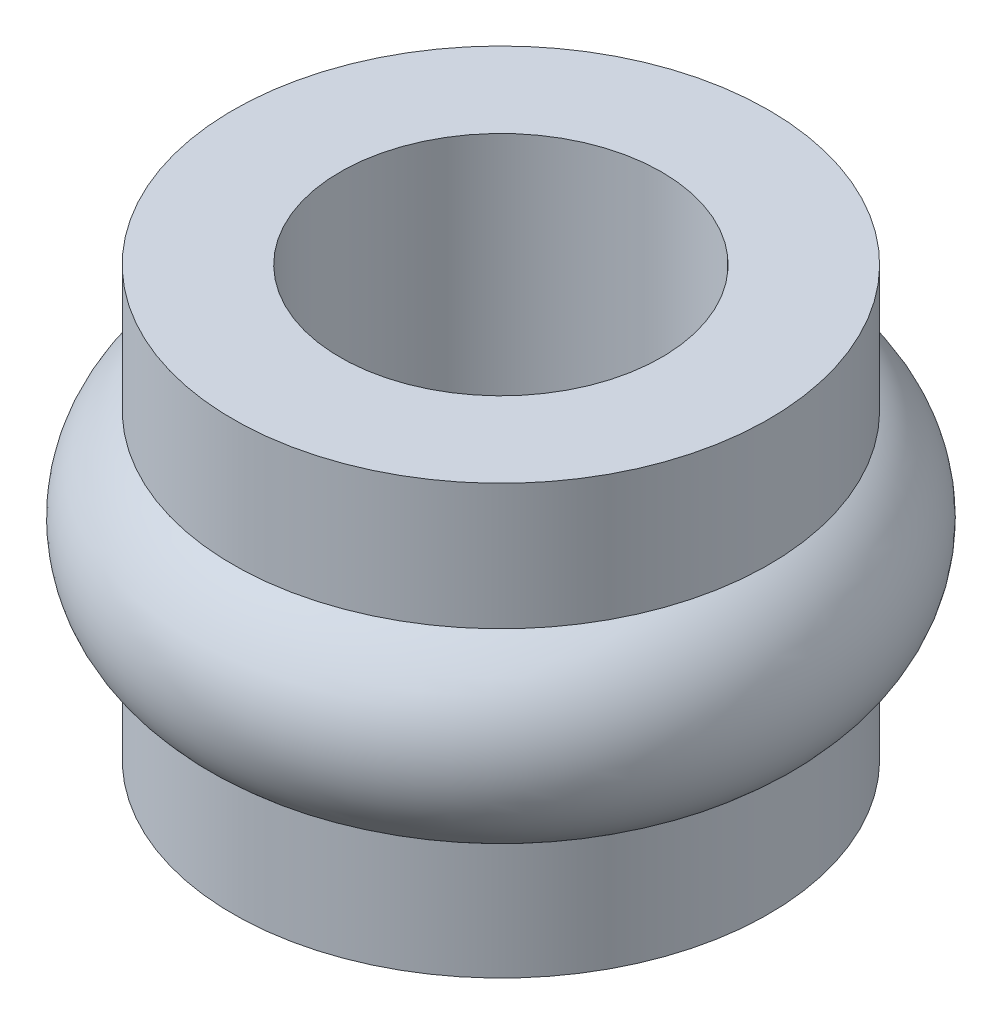
ISO-10303-21;
HEADER;
FILE_DESCRIPTION(('STEP AP214'),'2;1');
FILE_NAME('part.step','',(''),(''),'','','');
FILE_SCHEMA(('AUTOMOTIVE_DESIGN { 1 0 10303 214 1 1 1 1 }'));
ENDSEC;
DATA;
#1=APPLICATION_CONTEXT('core data for automotive mechanical design processes');
#2=APPLICATION_PROTOCOL_DEFINITION('international standard','automotive_design',2000,#1);
#3=PRODUCT_CONTEXT('',#1,'mechanical');
#4=PRODUCT('Part','Part','',(#3));
#5=PRODUCT_RELATED_PRODUCT_CATEGORY('part','',(#4));
#6=PRODUCT_DEFINITION_FORMATION('','',#4);
#7=PRODUCT_DEFINITION_CONTEXT('part definition',#1,'design');
#8=PRODUCT_DEFINITION('design','',#6,#7);
#9=PRODUCT_DEFINITION_SHAPE('','',#8);
#10=(LENGTH_UNIT() NAMED_UNIT(*) SI_UNIT(.MILLI.,.METRE.));
#11=(NAMED_UNIT(*) PLANE_ANGLE_UNIT() SI_UNIT($,.RADIAN.));
#12=(NAMED_UNIT(*) SI_UNIT($,.STERADIAN.) SOLID_ANGLE_UNIT());
#13=UNCERTAINTY_MEASURE_WITH_UNIT(LENGTH_MEASURE(1.E-05),#10,'distance_accuracy_value','');
#14=(GEOMETRIC_REPRESENTATION_CONTEXT(3) GLOBAL_UNCERTAINTY_ASSIGNED_CONTEXT((#13)) GLOBAL_UNIT_ASSIGNED_CONTEXT((#10,
#11,#12)) REPRESENTATION_CONTEXT('',''));
#15=CARTESIAN_POINT('',(0.,0.,0.));
#16=DIRECTION('',(0.,0.,1.));
#17=DIRECTION('',(1.,0.,0.));
#18=AXIS2_PLACEMENT_3D('',#15,#16,#17);
#19=CARTESIAN_POINT('',(1.5,4.,0.));
#20=DIRECTION('',(0.,-1.,0.));
#21=DIRECTION('',(0.,0.,-1.));
#22=AXIS2_PLACEMENT_3D('',#19,#20,#21);
#23=PLANE('',#22);
#24=CARTESIAN_POINT('',(0.,4.,0.));
#25=DIRECTION('',(0.,-1.,0.));
#26=DIRECTION('',(0.,0.,-1.));
#27=AXIS2_PLACEMENT_3D('',#24,#25,#26);
#28=CIRCLE('',#27,2.5);
#29=CARTESIAN_POINT('',(0.,4.,-2.5));
#30=VERTEX_POINT('',#29);
#31=EDGE_CURVE('E52',#30,#30,#28,.T.);
#32=ORIENTED_EDGE('',*,*,#31,.F.);
#33=EDGE_LOOP('',(#32));
#34=FACE_BOUND('',#33,.T.);
#35=CARTESIAN_POINT('',(0.,4.,0.));
#36=DIRECTION('',(0.,-1.,0.));
#37=DIRECTION('',(0.,0.,-1.));
#38=AXIS2_PLACEMENT_3D('',#35,#36,#37);
#39=CIRCLE('',#38,1.5);
#40=CARTESIAN_POINT('',(0.,4.,-1.5));
#41=VERTEX_POINT('',#40);
#42=EDGE_CURVE('E10',#41,#41,#39,.T.);
#43=ORIENTED_EDGE('',*,*,#42,.T.);
#44=EDGE_LOOP('',(#43));
#45=FACE_BOUND('',#44,.T.);
#46=ADVANCED_FACE('F30',(#34,#45),#23,.F.);
#47=CARTESIAN_POINT('',(0.,0.,0.));
#48=DIRECTION('',(0.,-1.,0.));
#49=DIRECTION('',(0.,0.,-1.));
#50=AXIS2_PLACEMENT_3D('',#47,#48,#49);
#51=CYLINDRICAL_SURFACE('',#50,1.5);
#52=ORIENTED_EDGE('',*,*,#42,.F.);
#53=EDGE_LOOP('',(#52));
#54=FACE_BOUND('',#53,.T.);
#55=CARTESIAN_POINT('',(0.,0.,0.));
#56=DIRECTION('',(0.,-1.,0.));
#57=DIRECTION('',(0.,0.,-1.));
#58=AXIS2_PLACEMENT_3D('',#55,#56,#57);
#59=CIRCLE('',#58,1.5);
#60=CARTESIAN_POINT('',(0.,0.,-1.5));
#61=VERTEX_POINT('',#60);
#62=EDGE_CURVE('E36',#61,#61,#59,.T.);
#63=ORIENTED_EDGE('',*,*,#62,.T.);
#64=EDGE_LOOP('',(#63));
#65=FACE_BOUND('',#64,.T.);
#66=ADVANCED_FACE('F59',(#54,#65),#51,.F.);
#67=CARTESIAN_POINT('',(2.5,0.,0.));
#68=DIRECTION('',(0.,1.,0.));
#69=DIRECTION('',(0.,0.,1.));
#70=AXIS2_PLACEMENT_3D('',#67,#68,#69);
#71=PLANE('',#70);
#72=ORIENTED_EDGE('',*,*,#62,.F.);
#73=EDGE_LOOP('',(#72));
#74=FACE_BOUND('',#73,.T.);
#75=CARTESIAN_POINT('',(0.,0.,0.));
#76=DIRECTION('',(0.,-1.,0.));
#77=DIRECTION('',(0.,0.,-1.));
#78=AXIS2_PLACEMENT_3D('',#75,#76,#77);
#79=CIRCLE('',#78,2.5);
#80=CARTESIAN_POINT('',(0.,0.,-2.5));
#81=VERTEX_POINT('',#80);
#82=EDGE_CURVE('E40',#81,#81,#79,.T.);
#83=ORIENTED_EDGE('',*,*,#82,.T.);
#84=EDGE_LOOP('',(#83));
#85=FACE_BOUND('',#84,.T.);
#86=ADVANCED_FACE('F63',(#74,#85),#71,.F.);
#87=CARTESIAN_POINT('',(0.,0.,0.));
#88=DIRECTION('',(0.,-1.,0.));
#89=DIRECTION('',(0.,0.,-1.));
#90=AXIS2_PLACEMENT_3D('',#87,#88,#89);
#91=CYLINDRICAL_SURFACE('',#90,2.5);
#92=ORIENTED_EDGE('',*,*,#82,.F.);
#93=EDGE_LOOP('',(#92));
#94=FACE_BOUND('',#93,.T.);
#95=CARTESIAN_POINT('',(0.,1.09164341327863,0.));
#96=DIRECTION('',(0.,-1.,0.));
#97=DIRECTION('',(0.,0.,-1.));
#98=AXIS2_PLACEMENT_3D('',#95,#96,#97);
#99=CIRCLE('',#98,2.5);
#100=CARTESIAN_POINT('',(0.,1.09164341327863,-2.5));
#101=VERTEX_POINT('',#100);
#102=EDGE_CURVE('E44',#101,#101,#99,.T.);
#103=ORIENTED_EDGE('',*,*,#102,.T.);
#104=EDGE_LOOP('',(#103));
#105=FACE_BOUND('',#104,.T.);
#106=ADVANCED_FACE('F68',(#94,#105),#91,.T.);
#107=CARTESIAN_POINT('',(0.,1.95766881706306,0.));
#108=DIRECTION('',(0.,-1.,0.));
#109=DIRECTION('',(0.,0.,-1.));
#110=AXIS2_PLACEMENT_3D('',#107,#108,#109);
#111=TOROIDAL_SURFACE('',#110,2.,1.);
#112=CARTESIAN_POINT('',(0.,2.8236942208475,0.));
#113=DIRECTION('',(0.,-1.,0.));
#114=DIRECTION('',(0.,0.,-1.));
#115=AXIS2_PLACEMENT_3D('',#112,#113,#114);
#116=CIRCLE('',#115,2.5);
#117=CARTESIAN_POINT('',(0.,2.8236942208475,-2.5));
#118=VERTEX_POINT('',#117);
#119=EDGE_CURVE('E49',#118,#118,#116,.T.);
#120=ORIENTED_EDGE('',*,*,#119,.T.);
#121=EDGE_LOOP('',(#120));
#122=FACE_BOUND('',#121,.T.);
#123=ORIENTED_EDGE('',*,*,#102,.F.);
#124=EDGE_LOOP('',(#123));
#125=FACE_BOUND('',#124,.T.);
#126=ADVANCED_FACE('F74',(#122,#125),#111,.T.);
#127=CARTESIAN_POINT('',(0.,0.,0.));
#128=DIRECTION('',(0.,-1.,0.));
#129=DIRECTION('',(0.,0.,-1.));
#130=AXIS2_PLACEMENT_3D('',#127,#128,#129);
#131=CYLINDRICAL_SURFACE('',#130,2.5);
#132=ORIENTED_EDGE('',*,*,#119,.F.);
#133=EDGE_LOOP('',(#132));
#134=FACE_BOUND('',#133,.T.);
#135=ORIENTED_EDGE('',*,*,#31,.T.);
#136=EDGE_LOOP('',(#135));
#137=FACE_BOUND('',#136,.T.);
#138=ADVANCED_FACE('F56',(#134,#137),#131,.T.);
#139=CLOSED_SHELL('',(#46,#66,#86,#106,#126,#138));
#140=MANIFOLD_SOLID_BREP('B2',#139);
#141=ADVANCED_BREP_SHAPE_REPRESENTATION('',(#18,#140),#14);
#142=SHAPE_DEFINITION_REPRESENTATION(#9,#141);
ENDSEC;
END-ISO-10303-21;
